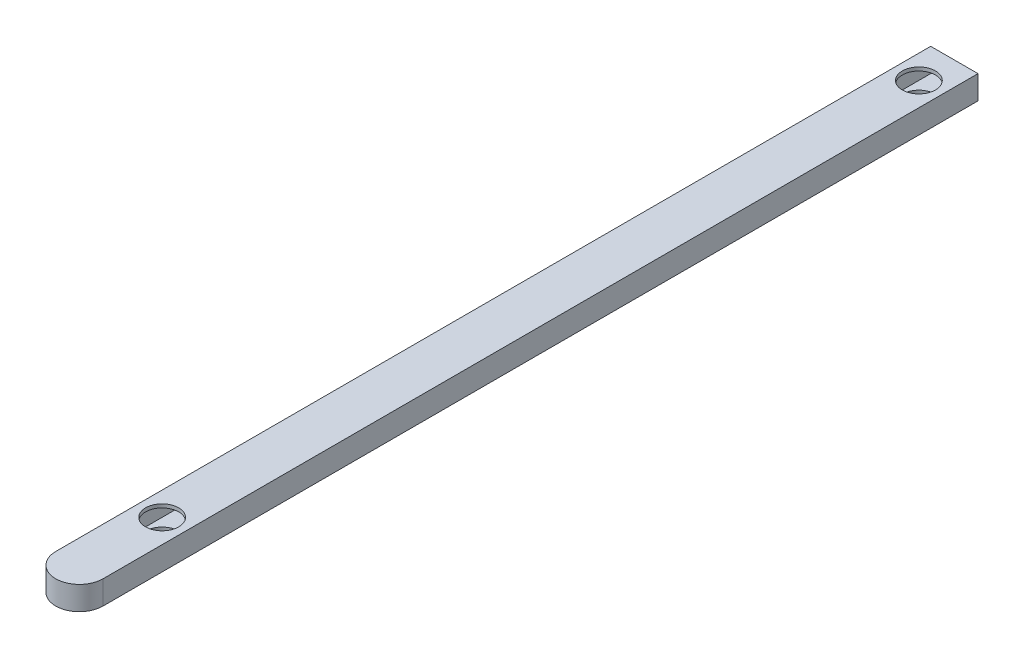
ISO-10303-21;
HEADER;
FILE_DESCRIPTION(('STEP AP214'),'2;1');
FILE_NAME('part.step','',(''),(''),'','','');
FILE_SCHEMA(('AUTOMOTIVE_DESIGN { 1 0 10303 214 1 1 1 1 }'));
ENDSEC;
DATA;
#1=APPLICATION_CONTEXT('core data for automotive mechanical design processes');
#2=APPLICATION_PROTOCOL_DEFINITION('international standard','automotive_design',2000,#1);
#3=PRODUCT_CONTEXT('',#1,'mechanical');
#4=PRODUCT('Part','Part','',(#3));
#5=PRODUCT_RELATED_PRODUCT_CATEGORY('part','',(#4));
#6=PRODUCT_DEFINITION_FORMATION('','',#4);
#7=PRODUCT_DEFINITION_CONTEXT('part definition',#1,'design');
#8=PRODUCT_DEFINITION('design','',#6,#7);
#9=PRODUCT_DEFINITION_SHAPE('','',#8);
#10=(LENGTH_UNIT() NAMED_UNIT(*) SI_UNIT(.MILLI.,.METRE.));
#11=(NAMED_UNIT(*) PLANE_ANGLE_UNIT() SI_UNIT($,.RADIAN.));
#12=(NAMED_UNIT(*) SI_UNIT($,.STERADIAN.) SOLID_ANGLE_UNIT());
#13=UNCERTAINTY_MEASURE_WITH_UNIT(LENGTH_MEASURE(1.E-05),#10,'distance_accuracy_value','');
#14=(GEOMETRIC_REPRESENTATION_CONTEXT(3) GLOBAL_UNCERTAINTY_ASSIGNED_CONTEXT((#13)) GLOBAL_UNIT_ASSIGNED_CONTEXT((#10,
#11,#12)) REPRESENTATION_CONTEXT('',''));
#15=CARTESIAN_POINT('',(0.,0.,0.));
#16=DIRECTION('',(0.,0.,1.));
#17=DIRECTION('',(1.,0.,0.));
#18=AXIS2_PLACEMENT_3D('',#15,#16,#17);
#19=CARTESIAN_POINT('',(0.,0.,0.));
#20=DIRECTION('',(0.,0.,1.));
#21=DIRECTION('',(1.,0.,0.));
#22=AXIS2_PLACEMENT_3D('',#19,#20,#21);
#23=PLANE('',#22);
#24=DIRECTION('',(0.,1.,0.));
#25=VECTOR('',#24,1.);
#26=CARTESIAN_POINT('',(10.,5.,0.));
#27=LINE('',#26,#25);
#28=CARTESIAN_POINT('',(10.,-5.,0.));
#29=VERTEX_POINT('',#28);
#30=CARTESIAN_POINT('',(10.,5.,0.));
#31=VERTEX_POINT('',#30);
#32=EDGE_CURVE('E203',#29,#31,#27,.T.);
#33=ORIENTED_EDGE('',*,*,#32,.F.);
#34=DIRECTION('',(1.,0.,0.));
#35=VECTOR('',#34,1.);
#36=CARTESIAN_POINT('',(-10.,-5.,0.));
#37=LINE('',#36,#35);
#38=CARTESIAN_POINT('',(-10.,-5.,0.));
#39=VERTEX_POINT('',#38);
#40=EDGE_CURVE('E86',#39,#29,#37,.T.);
#41=ORIENTED_EDGE('',*,*,#40,.F.);
#42=DIRECTION('',(0.,-1.,0.));
#43=VECTOR('',#42,1.);
#44=CARTESIAN_POINT('',(-10.,5.,0.));
#45=LINE('',#44,#43);
#46=CARTESIAN_POINT('',(-10.,5.,0.));
#47=VERTEX_POINT('',#46);
#48=EDGE_CURVE('E212',#47,#39,#45,.T.);
#49=ORIENTED_EDGE('',*,*,#48,.F.);
#50=DIRECTION('',(-1.,0.,0.));
#51=VECTOR('',#50,1.);
#52=CARTESIAN_POINT('',(-10.,5.,0.));
#53=LINE('',#52,#51);
#54=EDGE_CURVE('E209',#31,#47,#53,.T.);
#55=ORIENTED_EDGE('',*,*,#54,.F.);
#56=EDGE_LOOP('',(#33,#41,#49,#55));
#57=FACE_BOUND('',#56,.T.);
#58=DIRECTION('',(0.,1.,0.));
#59=VECTOR('',#58,1.);
#60=CARTESIAN_POINT('',(8.5,3.5,0.));
#61=LINE('',#60,#59);
#62=CARTESIAN_POINT('',(8.5,-3.5,0.));
#63=VERTEX_POINT('',#62);
#64=CARTESIAN_POINT('',(8.5,3.5,0.));
#65=VERTEX_POINT('',#64);
#66=EDGE_CURVE('E57',#63,#65,#61,.T.);
#67=ORIENTED_EDGE('',*,*,#66,.T.);
#68=DIRECTION('',(-1.,0.,0.));
#69=VECTOR('',#68,1.);
#70=CARTESIAN_POINT('',(-8.5,3.5,0.));
#71=LINE('',#70,#69);
#72=CARTESIAN_POINT('',(-8.5,3.5,0.));
#73=VERTEX_POINT('',#72);
#74=EDGE_CURVE('E182',#65,#73,#71,.T.);
#75=ORIENTED_EDGE('',*,*,#74,.T.);
#76=DIRECTION('',(0.,-1.,0.));
#77=VECTOR('',#76,1.);
#78=CARTESIAN_POINT('',(-8.5,3.5,0.));
#79=LINE('',#78,#77);
#80=CARTESIAN_POINT('',(-8.5,-3.5,0.));
#81=VERTEX_POINT('',#80);
#82=EDGE_CURVE('E186',#73,#81,#79,.T.);
#83=ORIENTED_EDGE('',*,*,#82,.T.);
#84=DIRECTION('',(1.,0.,0.));
#85=VECTOR('',#84,1.);
#86=CARTESIAN_POINT('',(-8.5,-3.5,0.));
#87=LINE('',#86,#85);
#88=EDGE_CURVE('E167',#81,#63,#87,.T.);
#89=ORIENTED_EDGE('',*,*,#88,.T.);
#90=EDGE_LOOP('',(#67,#75,#83,#89));
#91=FACE_BOUND('',#90,.T.);
#92=ADVANCED_FACE('F39',(#57,#91),#23,.F.);
#93=CARTESIAN_POINT('',(10.,5.,370.));
#94=DIRECTION('',(-1.,0.,0.));
#95=DIRECTION('',(0.,0.,1.));
#96=AXIS2_PLACEMENT_3D('',#93,#94,#95);
#97=PLANE('',#96);
#98=ORIENTED_EDGE('',*,*,#32,.T.);
#99=DIRECTION('',(0.,0.,-1.));
#100=VECTOR('',#99,1.);
#101=CARTESIAN_POINT('',(10.,5.,370.));
#102=LINE('',#101,#100);
#103=CARTESIAN_POINT('',(10.,5.,370.));
#104=VERTEX_POINT('',#103);
#105=EDGE_CURVE('E11',#104,#31,#102,.T.);
#106=ORIENTED_EDGE('',*,*,#105,.F.);
#107=DIRECTION('',(0.,1.,0.));
#108=VECTOR('',#107,1.);
#109=CARTESIAN_POINT('',(10.,5.,370.));
#110=LINE('',#109,#108);
#111=CARTESIAN_POINT('',(10.,-5.,370.));
#112=VERTEX_POINT('',#111);
#113=EDGE_CURVE('E115',#112,#104,#110,.T.);
#114=ORIENTED_EDGE('',*,*,#113,.F.);
#115=DIRECTION('',(0.,0.,-1.));
#116=VECTOR('',#115,1.);
#117=CARTESIAN_POINT('',(10.,-5.,370.));
#118=LINE('',#117,#116);
#119=EDGE_CURVE('E116',#112,#29,#118,.T.);
#120=ORIENTED_EDGE('',*,*,#119,.T.);
#121=EDGE_LOOP('',(#98,#106,#114,#120));
#122=FACE_BOUND('',#121,.T.);
#123=ADVANCED_FACE('F41',(#122),#97,.F.);
#124=CARTESIAN_POINT('',(-10.,5.,370.));
#125=DIRECTION('',(0.,-1.,0.));
#126=DIRECTION('',(0.,0.,-1.));
#127=AXIS2_PLACEMENT_3D('',#124,#125,#126);
#128=PLANE('',#127);
#129=CARTESIAN_POINT('',(0.,5.,15.));
#130=DIRECTION('',(0.,1.,0.));
#131=DIRECTION('',(0.,0.,1.));
#132=AXIS2_PLACEMENT_3D('',#129,#130,#131);
#133=CIRCLE('',#132,7.);
#134=CARTESIAN_POINT('',(0.,5.,22.));
#135=VERTEX_POINT('',#134);
#136=EDGE_CURVE('E147',#135,#135,#133,.T.);
#137=ORIENTED_EDGE('',*,*,#136,.F.);
#138=EDGE_LOOP('',(#137));
#139=FACE_BOUND('',#138,.T.);
#140=CARTESIAN_POINT('',(0.,5.,335.));
#141=DIRECTION('',(0.,1.,0.));
#142=DIRECTION('',(0.,0.,1.));
#143=AXIS2_PLACEMENT_3D('',#140,#141,#142);
#144=CIRCLE('',#143,7.);
#145=CARTESIAN_POINT('',(0.,5.,342.));
#146=VERTEX_POINT('',#145);
#147=EDGE_CURVE('E132',#146,#146,#144,.T.);
#148=ORIENTED_EDGE('',*,*,#147,.F.);
#149=EDGE_LOOP('',(#148));
#150=FACE_BOUND('',#149,.T.);
#151=ORIENTED_EDGE('',*,*,#54,.T.);
#152=DIRECTION('',(0.,0.,-1.));
#153=VECTOR('',#152,1.);
#154=CARTESIAN_POINT('',(-10.,5.,370.));
#155=LINE('',#154,#153);
#156=CARTESIAN_POINT('',(-10.,5.,370.));
#157=VERTEX_POINT('',#156);
#158=EDGE_CURVE('E49',#157,#47,#155,.T.);
#159=ORIENTED_EDGE('',*,*,#158,.F.);
#160=CARTESIAN_POINT('',(0.,5.,370.));
#161=DIRECTION('',(0.,1.,0.));
#162=DIRECTION('',(0.,0.,1.));
#163=AXIS2_PLACEMENT_3D('',#160,#161,#162);
#164=CIRCLE('',#163,10.);
#165=EDGE_CURVE('E133',#157,#104,#164,.T.);
#166=ORIENTED_EDGE('',*,*,#165,.T.);
#167=ORIENTED_EDGE('',*,*,#105,.T.);
#168=EDGE_LOOP('',(#151,#159,#166,#167));
#169=FACE_BOUND('',#168,.T.);
#170=ADVANCED_FACE('F263',(#139,#150,#169),#128,.F.);
#171=CARTESIAN_POINT('',(-10.,5.,370.));
#172=DIRECTION('',(1.,0.,0.));
#173=DIRECTION('',(0.,1.,0.));
#174=AXIS2_PLACEMENT_3D('',#171,#172,#173);
#175=PLANE('',#174);
#176=ORIENTED_EDGE('',*,*,#48,.T.);
#177=DIRECTION('',(0.,0.,-1.));
#178=VECTOR('',#177,1.);
#179=CARTESIAN_POINT('',(-10.,-5.,370.));
#180=LINE('',#179,#178);
#181=CARTESIAN_POINT('',(-10.,-5.,370.));
#182=VERTEX_POINT('',#181);
#183=EDGE_CURVE('E66',#182,#39,#180,.T.);
#184=ORIENTED_EDGE('',*,*,#183,.F.);
#185=DIRECTION('',(0.,-1.,0.));
#186=VECTOR('',#185,1.);
#187=CARTESIAN_POINT('',(-10.,5.,370.));
#188=LINE('',#187,#186);
#189=EDGE_CURVE('E123',#157,#182,#188,.T.);
#190=ORIENTED_EDGE('',*,*,#189,.F.);
#191=ORIENTED_EDGE('',*,*,#158,.T.);
#192=EDGE_LOOP('',(#176,#184,#190,#191));
#193=FACE_BOUND('',#192,.T.);
#194=ADVANCED_FACE('F254',(#193),#175,.F.);
#195=CARTESIAN_POINT('',(-10.,-5.,370.));
#196=DIRECTION('',(0.,1.,0.));
#197=DIRECTION('',(0.,0.,1.));
#198=AXIS2_PLACEMENT_3D('',#195,#196,#197);
#199=PLANE('',#198);
#200=CARTESIAN_POINT('',(0.,-5.,15.));
#201=DIRECTION('',(0.,1.,0.));
#202=DIRECTION('',(0.,0.,1.));
#203=AXIS2_PLACEMENT_3D('',#200,#201,#202);
#204=CIRCLE('',#203,7.);
#205=CARTESIAN_POINT('',(0.,-5.,22.));
#206=VERTEX_POINT('',#205);
#207=EDGE_CURVE('E142',#206,#206,#204,.T.);
#208=ORIENTED_EDGE('',*,*,#207,.T.);
#209=EDGE_LOOP('',(#208));
#210=FACE_BOUND('',#209,.T.);
#211=CARTESIAN_POINT('',(0.,-5.,335.));
#212=DIRECTION('',(0.,1.,0.));
#213=DIRECTION('',(0.,0.,1.));
#214=AXIS2_PLACEMENT_3D('',#211,#212,#213);
#215=CIRCLE('',#214,7.);
#216=CARTESIAN_POINT('',(0.,-5.,342.));
#217=VERTEX_POINT('',#216);
#218=EDGE_CURVE('E138',#217,#217,#215,.T.);
#219=ORIENTED_EDGE('',*,*,#218,.T.);
#220=EDGE_LOOP('',(#219));
#221=FACE_BOUND('',#220,.T.);
#222=ORIENTED_EDGE('',*,*,#40,.T.);
#223=ORIENTED_EDGE('',*,*,#119,.F.);
#224=CARTESIAN_POINT('',(0.,-5.,370.));
#225=DIRECTION('',(0.,1.,0.));
#226=DIRECTION('',(0.,0.,1.));
#227=AXIS2_PLACEMENT_3D('',#224,#225,#226);
#228=CIRCLE('',#227,10.);
#229=EDGE_CURVE('E127',#182,#112,#228,.T.);
#230=ORIENTED_EDGE('',*,*,#229,.F.);
#231=ORIENTED_EDGE('',*,*,#183,.T.);
#232=EDGE_LOOP('',(#222,#223,#230,#231));
#233=FACE_BOUND('',#232,.T.);
#234=ADVANCED_FACE('F126',(#210,#221,#233),#199,.F.);
#235=CARTESIAN_POINT('',(8.5,3.5,370.));
#236=DIRECTION('',(-1.,0.,0.));
#237=DIRECTION('',(0.,0.,1.));
#238=AXIS2_PLACEMENT_3D('',#235,#236,#237);
#239=PLANE('',#238);
#240=ORIENTED_EDGE('',*,*,#66,.F.);
#241=DIRECTION('',(0.,0.,-1.));
#242=VECTOR('',#241,1.);
#243=CARTESIAN_POINT('',(8.5,-3.5,370.));
#244=LINE('',#243,#242);
#245=CARTESIAN_POINT('',(8.5,-3.5,370.));
#246=VERTEX_POINT('',#245);
#247=EDGE_CURVE('E179',#246,#63,#244,.T.);
#248=ORIENTED_EDGE('',*,*,#247,.F.);
#249=DIRECTION('',(0.,1.,0.));
#250=VECTOR('',#249,1.);
#251=CARTESIAN_POINT('',(8.5,3.5,370.));
#252=LINE('',#251,#250);
#253=CARTESIAN_POINT('',(8.5,3.5,370.));
#254=VERTEX_POINT('',#253);
#255=EDGE_CURVE('E162',#246,#254,#252,.T.);
#256=ORIENTED_EDGE('',*,*,#255,.T.);
#257=DIRECTION('',(0.,0.,-1.));
#258=VECTOR('',#257,1.);
#259=CARTESIAN_POINT('',(8.5,3.5,370.));
#260=LINE('',#259,#258);
#261=EDGE_CURVE('E201',#254,#65,#260,.T.);
#262=ORIENTED_EDGE('',*,*,#261,.T.);
#263=EDGE_LOOP('',(#240,#248,#256,#262));
#264=FACE_BOUND('',#263,.T.);
#265=ADVANCED_FACE('F245',(#264),#239,.T.);
#266=CARTESIAN_POINT('',(-8.5,3.5,370.));
#267=DIRECTION('',(0.,-1.,0.));
#268=DIRECTION('',(0.,0.,-1.));
#269=AXIS2_PLACEMENT_3D('',#266,#267,#268);
#270=PLANE('',#269);
#271=CARTESIAN_POINT('',(0.,3.5,15.));
#272=DIRECTION('',(0.,-1.,0.));
#273=DIRECTION('',(0.,0.,-1.));
#274=AXIS2_PLACEMENT_3D('',#271,#272,#273);
#275=CIRCLE('',#274,7.);
#276=CARTESIAN_POINT('',(0.,3.5,8.));
#277=VERTEX_POINT('',#276);
#278=EDGE_CURVE('E158',#277,#277,#275,.T.);
#279=ORIENTED_EDGE('',*,*,#278,.F.);
#280=EDGE_LOOP('',(#279));
#281=FACE_BOUND('',#280,.T.);
#282=CARTESIAN_POINT('',(0.,3.5,335.));
#283=DIRECTION('',(0.,-1.,0.));
#284=DIRECTION('',(0.,0.,-1.));
#285=AXIS2_PLACEMENT_3D('',#282,#283,#284);
#286=CIRCLE('',#285,7.);
#287=CARTESIAN_POINT('',(0.,3.5,328.));
#288=VERTEX_POINT('',#287);
#289=EDGE_CURVE('E154',#288,#288,#286,.T.);
#290=ORIENTED_EDGE('',*,*,#289,.F.);
#291=EDGE_LOOP('',(#290));
#292=FACE_BOUND('',#291,.T.);
#293=ORIENTED_EDGE('',*,*,#74,.F.);
#294=ORIENTED_EDGE('',*,*,#261,.F.);
#295=DIRECTION('',(-1.,0.,0.));
#296=VECTOR('',#295,1.);
#297=CARTESIAN_POINT('',(-8.5,3.5,370.));
#298=LINE('',#297,#296);
#299=CARTESIAN_POINT('',(-8.5,3.5,370.));
#300=VERTEX_POINT('',#299);
#301=EDGE_CURVE('E166',#254,#300,#298,.T.);
#302=ORIENTED_EDGE('',*,*,#301,.T.);
#303=DIRECTION('',(0.,0.,-1.));
#304=VECTOR('',#303,1.);
#305=CARTESIAN_POINT('',(-8.5,3.5,370.));
#306=LINE('',#305,#304);
#307=EDGE_CURVE('E198',#300,#73,#306,.T.);
#308=ORIENTED_EDGE('',*,*,#307,.T.);
#309=EDGE_LOOP('',(#293,#294,#302,#308));
#310=FACE_BOUND('',#309,.T.);
#311=ADVANCED_FACE('F244',(#281,#292,#310),#270,.T.);
#312=CARTESIAN_POINT('',(-8.5,3.5,370.));
#313=DIRECTION('',(1.,0.,0.));
#314=DIRECTION('',(0.,0.,-1.));
#315=AXIS2_PLACEMENT_3D('',#312,#313,#314);
#316=PLANE('',#315);
#317=ORIENTED_EDGE('',*,*,#82,.F.);
#318=ORIENTED_EDGE('',*,*,#307,.F.);
#319=DIRECTION('',(0.,-1.,0.));
#320=VECTOR('',#319,1.);
#321=CARTESIAN_POINT('',(-8.5,3.5,370.));
#322=LINE('',#321,#320);
#323=CARTESIAN_POINT('',(-8.5,-3.5,370.));
#324=VERTEX_POINT('',#323);
#325=EDGE_CURVE('E171',#300,#324,#322,.T.);
#326=ORIENTED_EDGE('',*,*,#325,.T.);
#327=DIRECTION('',(0.,0.,-1.));
#328=VECTOR('',#327,1.);
#329=CARTESIAN_POINT('',(-8.5,-3.5,370.));
#330=LINE('',#329,#328);
#331=EDGE_CURVE('E195',#324,#81,#330,.T.);
#332=ORIENTED_EDGE('',*,*,#331,.T.);
#333=EDGE_LOOP('',(#317,#318,#326,#332));
#334=FACE_BOUND('',#333,.T.);
#335=ADVANCED_FACE('F231',(#334),#316,.T.);
#336=CARTESIAN_POINT('',(-8.5,-3.5,370.));
#337=DIRECTION('',(0.,1.,0.));
#338=DIRECTION('',(0.,0.,1.));
#339=AXIS2_PLACEMENT_3D('',#336,#337,#338);
#340=PLANE('',#339);
#341=CARTESIAN_POINT('',(0.,-3.5,15.));
#342=DIRECTION('',(0.,1.,0.));
#343=DIRECTION('',(0.,0.,1.));
#344=AXIS2_PLACEMENT_3D('',#341,#342,#343);
#345=CIRCLE('',#344,7.);
#346=CARTESIAN_POINT('',(0.,-3.5,22.));
#347=VERTEX_POINT('',#346);
#348=EDGE_CURVE('E43',#347,#347,#345,.T.);
#349=ORIENTED_EDGE('',*,*,#348,.F.);
#350=EDGE_LOOP('',(#349));
#351=FACE_BOUND('',#350,.T.);
#352=CARTESIAN_POINT('',(0.,-3.5,335.));
#353=DIRECTION('',(0.,1.,0.));
#354=DIRECTION('',(0.,0.,1.));
#355=AXIS2_PLACEMENT_3D('',#352,#353,#354);
#356=CIRCLE('',#355,7.);
#357=CARTESIAN_POINT('',(0.,-3.5,342.));
#358=VERTEX_POINT('',#357);
#359=EDGE_CURVE('E146',#358,#358,#356,.T.);
#360=ORIENTED_EDGE('',*,*,#359,.F.);
#361=EDGE_LOOP('',(#360));
#362=FACE_BOUND('',#361,.T.);
#363=ORIENTED_EDGE('',*,*,#88,.F.);
#364=ORIENTED_EDGE('',*,*,#331,.F.);
#365=DIRECTION('',(1.,0.,0.));
#366=VECTOR('',#365,1.);
#367=CARTESIAN_POINT('',(-8.5,-3.5,370.));
#368=LINE('',#367,#366);
#369=EDGE_CURVE('E175',#324,#246,#368,.T.);
#370=ORIENTED_EDGE('',*,*,#369,.T.);
#371=ORIENTED_EDGE('',*,*,#247,.T.);
#372=EDGE_LOOP('',(#363,#364,#370,#371));
#373=FACE_BOUND('',#372,.T.);
#374=ADVANCED_FACE('F228',(#351,#362,#373),#340,.T.);
#375=CARTESIAN_POINT('',(0.,-5.,335.));
#376=DIRECTION('',(0.,1.,0.));
#377=DIRECTION('',(0.,0.,1.));
#378=AXIS2_PLACEMENT_3D('',#375,#376,#377);
#379=CYLINDRICAL_SURFACE('',#378,7.);
#380=ORIENTED_EDGE('',*,*,#359,.T.);
#381=EDGE_LOOP('',(#380));
#382=FACE_BOUND('',#381,.T.);
#383=ORIENTED_EDGE('',*,*,#218,.F.);
#384=EDGE_LOOP('',(#383));
#385=FACE_BOUND('',#384,.T.);
#386=ADVANCED_FACE('F225',(#382,#385),#379,.F.);
#387=CARTESIAN_POINT('',(0.,-5.,15.));
#388=DIRECTION('',(0.,1.,0.));
#389=DIRECTION('',(0.,0.,1.));
#390=AXIS2_PLACEMENT_3D('',#387,#388,#389);
#391=CYLINDRICAL_SURFACE('',#390,7.);
#392=ORIENTED_EDGE('',*,*,#348,.T.);
#393=EDGE_LOOP('',(#392));
#394=FACE_BOUND('',#393,.T.);
#395=ORIENTED_EDGE('',*,*,#207,.F.);
#396=EDGE_LOOP('',(#395));
#397=FACE_BOUND('',#396,.T.);
#398=ADVANCED_FACE('F279',(#394,#397),#391,.F.);
#399=ORIENTED_EDGE('',*,*,#289,.T.);
#400=EDGE_LOOP('',(#399));
#401=FACE_BOUND('',#400,.T.);
#402=ORIENTED_EDGE('',*,*,#147,.T.);
#403=EDGE_LOOP('',(#402));
#404=FACE_BOUND('',#403,.T.);
#405=ADVANCED_FACE('F276',(#401,#404),#379,.F.);
#406=ORIENTED_EDGE('',*,*,#278,.T.);
#407=EDGE_LOOP('',(#406));
#408=FACE_BOUND('',#407,.T.);
#409=ORIENTED_EDGE('',*,*,#136,.T.);
#410=EDGE_LOOP('',(#409));
#411=FACE_BOUND('',#410,.T.);
#412=ADVANCED_FACE('F278',(#408,#411),#391,.F.);
#413=CARTESIAN_POINT('',(-10.,-5.,370.));
#414=DIRECTION('',(0.,0.,-1.));
#415=DIRECTION('',(-1.,0.,0.));
#416=AXIS2_PLACEMENT_3D('',#413,#414,#415);
#417=PLANE('',#416);
#418=ORIENTED_EDGE('',*,*,#301,.F.);
#419=ORIENTED_EDGE('',*,*,#255,.F.);
#420=ORIENTED_EDGE('',*,*,#369,.F.);
#421=ORIENTED_EDGE('',*,*,#325,.F.);
#422=EDGE_LOOP('',(#418,#419,#420,#421));
#423=FACE_BOUND('',#422,.T.);
#424=ADVANCED_FACE('F241',(#423),#417,.T.);
#425=CARTESIAN_POINT('',(0.,-5.,370.));
#426=DIRECTION('',(0.,1.,0.));
#427=DIRECTION('',(0.,0.,1.));
#428=AXIS2_PLACEMENT_3D('',#425,#426,#427);
#429=CYLINDRICAL_SURFACE('',#428,10.);
#430=ORIENTED_EDGE('',*,*,#165,.F.);
#431=ORIENTED_EDGE('',*,*,#189,.T.);
#432=ORIENTED_EDGE('',*,*,#229,.T.);
#433=ORIENTED_EDGE('',*,*,#113,.T.);
#434=EDGE_LOOP('',(#430,#431,#432,#433));
#435=FACE_BOUND('',#434,.T.);
#436=ADVANCED_FACE('F130',(#435),#429,.T.);
#437=CLOSED_SHELL('',(#92,#123,#170,#194,#234,#265,#311,#335,#374,#386,#398,#405,#412,#424,#436));
#438=MANIFOLD_SOLID_BREP('B2',#437);
#439=ADVANCED_BREP_SHAPE_REPRESENTATION('',(#18,#438),#14);
#440=SHAPE_DEFINITION_REPRESENTATION(#9,#439);
ENDSEC;
END-ISO-10303-21;
